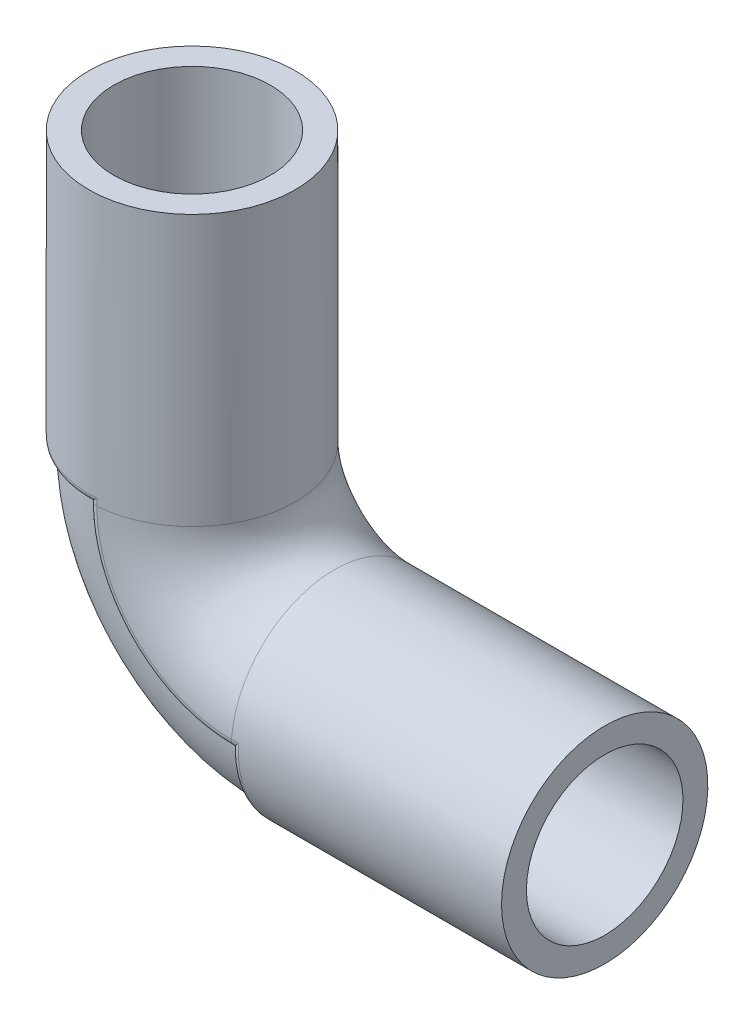
ISO-10303-21;
HEADER;
FILE_DESCRIPTION(('STEP AP214'),'2;1');
FILE_NAME('part.step','',(''),(''),'','','');
FILE_SCHEMA(('AUTOMOTIVE_DESIGN { 1 0 10303 214 1 1 1 1 }'));
ENDSEC;
DATA;
#1=APPLICATION_CONTEXT('core data for automotive mechanical design processes');
#2=APPLICATION_PROTOCOL_DEFINITION('international standard','automotive_design',2000,#1);
#3=PRODUCT_CONTEXT('',#1,'mechanical');
#4=PRODUCT('Part','Part','',(#3));
#5=PRODUCT_RELATED_PRODUCT_CATEGORY('part','',(#4));
#6=PRODUCT_DEFINITION_FORMATION('','',#4);
#7=PRODUCT_DEFINITION_CONTEXT('part definition',#1,'design');
#8=PRODUCT_DEFINITION('design','',#6,#7);
#9=PRODUCT_DEFINITION_SHAPE('','',#8);
#10=(LENGTH_UNIT() NAMED_UNIT(*) SI_UNIT(.MILLI.,.METRE.));
#11=(NAMED_UNIT(*) PLANE_ANGLE_UNIT() SI_UNIT($,.RADIAN.));
#12=(NAMED_UNIT(*) SI_UNIT($,.STERADIAN.) SOLID_ANGLE_UNIT());
#13=UNCERTAINTY_MEASURE_WITH_UNIT(LENGTH_MEASURE(1.E-05),#10,'distance_accuracy_value','');
#14=(GEOMETRIC_REPRESENTATION_CONTEXT(3) GLOBAL_UNCERTAINTY_ASSIGNED_CONTEXT((#13)) GLOBAL_UNIT_ASSIGNED_CONTEXT((#10,
#11,#12)) REPRESENTATION_CONTEXT('',''));
#15=CARTESIAN_POINT('',(0.,0.,0.));
#16=DIRECTION('',(0.,0.,1.));
#17=DIRECTION('',(1.,0.,0.));
#18=AXIS2_PLACEMENT_3D('',#15,#16,#17);
#19=CARTESIAN_POINT('',(20.,20.,0.));
#20=DIRECTION('',(0.,0.,1.));
#21=DIRECTION('',(1.,0.,0.));
#22=AXIS2_PLACEMENT_3D('',#19,#20,#21);
#23=TOROIDAL_SURFACE('',#22,20.0000000000004,14.5);
#24=CARTESIAN_POINT('',(20.0000000000001,0.,0.));
#25=DIRECTION('',(-1.,0.,0.));
#26=DIRECTION('',(0.,0.,1.));
#27=AXIS2_PLACEMENT_3D('',#24,#25,#26);
#28=CIRCLE('',#27,14.5);
#29=CARTESIAN_POINT('',(20.0000000000001,1.07333714494823,14.460219478738));
#30=VERTEX_POINT('',#29);
#31=CARTESIAN_POINT('',(20.0000000000001,1.07333714494705,-14.4602194787382));
#32=VERTEX_POINT('',#31);
#33=EDGE_CURVE('E326',#30,#32,#28,.T.);
#34=ORIENTED_EDGE('',*,*,#33,.T.);
#35=CARTESIAN_POINT('',(20.0000000000002,20.0000000000002,-14.460219478738));
#36=DIRECTION('',(0.,0.,1.));
#37=DIRECTION('',(1.,0.,0.));
#38=AXIS2_PLACEMENT_3D('',#35,#36,#37);
#39=CIRCLE('',#38,18.9266628550516);
#40=CARTESIAN_POINT('',(1.07333714494705,20.0000000000001,-14.4602194787382));
#41=VERTEX_POINT('',#40);
#42=EDGE_CURVE('E282',#32,#41,#39,.F.);
#43=ORIENTED_EDGE('',*,*,#42,.T.);
#44=CARTESIAN_POINT('',(0.,20.0000000000001,0.));
#45=DIRECTION('',(0.,1.,0.));
#46=DIRECTION('',(0.,0.,1.));
#47=AXIS2_PLACEMENT_3D('',#44,#45,#46);
#48=CIRCLE('',#47,14.5);
#49=CARTESIAN_POINT('',(1.07333714494823,20.0000000000001,14.460219478738));
#50=VERTEX_POINT('',#49);
#51=EDGE_CURVE('E325',#50,#41,#48,.T.);
#52=ORIENTED_EDGE('',*,*,#51,.F.);
#53=CARTESIAN_POINT('',(20.0000000000002,20.0000000000002,14.4602194787378));
#54=DIRECTION('',(0.,0.,-1.));
#55=DIRECTION('',(-1.,0.,0.));
#56=AXIS2_PLACEMENT_3D('',#53,#54,#55);
#57=CIRCLE('',#56,18.9266628550517);
#58=EDGE_CURVE('E142',#50,#30,#57,.F.);
#59=ORIENTED_EDGE('',*,*,#58,.T.);
#60=EDGE_LOOP('',(#34,#43,#52,#59));
#61=FACE_BOUND('',#60,.T.);
#62=ADVANCED_FACE('F44',(#61),#23,.T.);
#63=CARTESIAN_POINT('',(0.,58.,0.));
#64=DIRECTION('',(0.,-1.,0.));
#65=DIRECTION('',(0.,0.,-1.));
#66=AXIS2_PLACEMENT_3D('',#63,#64,#65);
#67=CYLINDRICAL_SURFACE('',#66,14.5);
#68=ORIENTED_EDGE('',*,*,#51,.T.);
#69=CARTESIAN_POINT('',(0.0646983123087329,18.3925963105887,-13.5));
#70=CARTESIAN_POINT('',(0.108368296469447,18.3895419345392,-14.5364157307015));
#71=CARTESIAN_POINT('',(1.13915791979438,18.4728964791616,-14.4551831269538));
#72=CARTESIAN_POINT('',(0.0363996600460458,18.7434508247518,-13.5));
#73=CARTESIAN_POINT('',(0.0777513723160988,18.7410433282352,-14.5367219092496));
#74=CARTESIAN_POINT('',(1.11037171634935,18.8062298566909,-14.4574144565209));
#75=CARTESIAN_POINT('',(0.0173806632408046,19.095059059414,-13.5));
#76=CARTESIAN_POINT('',(0.0571985536029757,19.0933180467772,-14.5368984945269));
#77=CARTESIAN_POINT('',(1.09102209634255,19.1402732361842,-14.4588900216303));
#78=CARTESIAN_POINT('',(-0.00205625623141033,19.7978189221536,-13.5));
#79=CARTESIAN_POINT('',(0.0362042412363847,19.7974527668298,-14.5370658681995));
#80=CARTESIAN_POINT('',(1.07124597262363,19.8079217479623,-14.4603872049827));
#81=CARTESIAN_POINT('',(-0.00252556464059526,20.1489691166365,-13.5));
#82=CARTESIAN_POINT('',(0.0357095393663063,20.1492679347153,-14.5370571498896));
#83=CARTESIAN_POINT('',(1.07076719353341,20.141525530599,-14.4604128398603));
#84=CARTESIAN_POINT('',(0.0150218266943723,20.8508032613276,-13.5));
#85=CARTESIAN_POINT('',(0.0546415892951053,20.8524110604805,-14.5369282390743));
#86=CARTESIAN_POINT('',(1.08862308738606,20.8082933221044,-14.4590794380943));
#87=CARTESIAN_POINT('',(0.0330384989538137,21.2014872122283,-13.5));
#88=CARTESIAN_POINT('',(0.0740670016949818,21.2037184850319,-14.5368080547353));
#89=CARTESIAN_POINT('',(1.1069577323574,21.1414573316262,-14.4577204035096));
#90=CARTESIAN_POINT('',(0.0875681420051222,21.9023792099268,-13.5));
#91=CARTESIAN_POINT('',(0.133142503997558,21.9059677713672,-14.5361306598162));
#92=CARTESIAN_POINT('',(1.16241781152524,21.8073488172217,-14.4533489849605));
#93=CARTESIAN_POINT('',(0.124132358869971,22.2525832280196,-13.5));
#94=CARTESIAN_POINT('',(0.172833518303441,22.2567844851374,-14.5355724589377));
#95=CARTESIAN_POINT('',(1.1995953074741,22.1400725091864,-14.4503320182652));
#96=CARTESIAN_POINT('',(0.169925224163276,22.6015638344513,-13.5));
#97=CARTESIAN_POINT('',(0.222733223063629,22.6063236063833,-14.5346319899954));
#98=CARTESIAN_POINT('',(1.24613160291782,22.4716479900093,-14.4463544199985));
#99=(BOUNDED_SURFACE() B_SPLINE_SURFACE(3,2,((#69,#70,#71),(#72,#73,#74),(#75,#76,#77),(#78,#79,
#80),(#81,#82,#83),(#84,#85,#86),(#87,#88,#89),(#90,#91,#92),(#93,#94,#95),(#96,#97,#98)),
.UNSPECIFIED.,.F.,.F.,.F.) B_SPLINE_SURFACE_WITH_KNOTS((4,2,2,2,4),(3,3),(0.,1.0031290493086,
2.00347906789508,3.00382759917657,4.00695522893697),(0.,1.),
.UNSPECIFIED.) GEOMETRIC_REPRESENTATION_ITEM() RATIONAL_B_SPLINE_SURFACE(((1.,0.694030552063765,
1.),(1.,0.693957886158268,1.),(1.,0.693918020027879,1.),(1.,0.693881305242108,1.),(1.,
0.693884337718714,1.),(1.,0.693910686045976,1.),(1.,0.693934001866477,1.),(1.,0.694100786883197,
1.),(1.,0.694244589701188,1.),(1.,0.694498922864589,1.))) REPRESENTATION_ITEM('') SURFACE());
#100=CARTESIAN_POINT('',(1.13915791979438,18.4728964791616,-14.4551831269538));
#101=CARTESIAN_POINT('',(1.11037171634935,18.8062298566909,-14.4574144565209));
#102=CARTESIAN_POINT('',(1.09102209634255,19.1402732361842,-14.4588900216303));
#103=CARTESIAN_POINT('',(1.07124597262363,19.8079217479623,-14.4603872049827));
#104=CARTESIAN_POINT('',(1.07076719353341,20.141525530599,-14.4604128398603));
#105=CARTESIAN_POINT('',(1.08862308738606,20.8082933221044,-14.4590794380943));
#106=CARTESIAN_POINT('',(1.1069577323574,21.1414573316262,-14.4577204035096));
#107=CARTESIAN_POINT('',(1.16241781152524,21.8073488172217,-14.4533489849605));
#108=CARTESIAN_POINT('',(1.1995953074741,22.1400725091864,-14.4503320182652));
#109=CARTESIAN_POINT('',(1.24613160291782,22.4716479900093,-14.4463544199985));
#110=B_SPLINE_CURVE_WITH_KNOTS('',3,(#100,#101,#102,#103,#104,#105,#106,#107,#108,#109),
.UNSPECIFIED.,.F.,.F.,(4,2,2,2,4),(0.,1.0031290493086,2.00347906789508,3.00382759917657,
4.00695522893697),.UNSPECIFIED.);
#111=CARTESIAN_POINT('',(1.1015400078443,21.,-14.4580984092348));
#112=VERTEX_POINT('',#111);
#113=EDGE_CURVE('E258',#41,#112,#110,.T.);
#114=ORIENTED_EDGE('',*,*,#113,.T.);
#115=CARTESIAN_POINT('',(0.,21.,0.));
#116=DIRECTION('',(0.,1.,0.));
#117=DIRECTION('',(0.,0.,1.));
#118=AXIS2_PLACEMENT_3D('',#115,#116,#117);
#119=CIRCLE('',#118,14.5);
#120=CARTESIAN_POINT('',(1.1015400078443,21.,14.4580984092348));
#121=VERTEX_POINT('',#120);
#122=EDGE_CURVE('E334',#112,#121,#119,.T.);
#123=ORIENTED_EDGE('',*,*,#122,.T.);
#124=CARTESIAN_POINT('',(1.13915791979437,18.4728964791616,14.4551831269538));
#125=CARTESIAN_POINT('',(0.108368296477715,18.3895419344437,14.5364157307009));
#126=CARTESIAN_POINT('',(0.0646983123161436,18.3925963104967,13.5));
#127=CARTESIAN_POINT('',(1.11037171634938,18.8062298566905,14.4574144565209));
#128=CARTESIAN_POINT('',(0.0777513725661896,18.7410433374481,14.5367219092309));
#129=CARTESIAN_POINT('',(0.0363996602710763,18.7434508336104,13.5));
#130=CARTESIAN_POINT('',(1.0910220963426,19.1402732361834,14.4588900216303));
#131=CARTESIAN_POINT('',(0.0571985537582045,19.0933180525399,14.5368984945153));
#132=CARTESIAN_POINT('',(0.0173806633803775,19.0950590649565,13.5));
#133=CARTESIAN_POINT('',(1.07124597262363,19.8079217479616,14.4603872049827));
#134=CARTESIAN_POINT('',(0.036204241081489,19.7974527610854,14.5370658682111));
#135=CARTESIAN_POINT('',(-0.00205625637056937,19.7978189166253,13.5));
#136=CARTESIAN_POINT('',(1.07076719353339,20.1415255305987,14.4604128398603));
#137=CARTESIAN_POINT('',(0.0357095389966667,20.1492679209302,14.5370571499172));
#138=CARTESIAN_POINT('',(-0.00252556497268866,20.1489691033655,13.5));
#139=CARTESIAN_POINT('',(1.08862308738606,20.8082933221044,14.4590794380943));
#140=CARTESIAN_POINT('',(0.0546415889262442,20.8524110467005,14.5369282391019));
#141=CARTESIAN_POINT('',(0.0150218263627442,20.8508032480524,13.5));
#142=CARTESIAN_POINT('',(1.1069577323574,21.1414573316262,14.4577204035096));
#143=CARTESIAN_POINT('',(0.0740670015413216,21.2037184792866,14.5368080547467));
#144=CARTESIAN_POINT('',(0.0330384988155648,21.2014872066915,13.5));
#145=CARTESIAN_POINT('',(1.16241781152524,21.8073488172217,14.4533489849605));
#146=CARTESIAN_POINT('',(0.133142504151485,21.9059677771257,14.5361306598047));
#147=CARTESIAN_POINT('',(0.0875681421439275,21.9023792154813,13.5));
#148=CARTESIAN_POINT('',(1.1995953074741,22.1400725091864,14.4503320182652));
#149=CARTESIAN_POINT('',(0.172833518549424,22.2567844943544,14.5355724589193));
#150=CARTESIAN_POINT('',(0.124132359092144,22.2525832369149,13.5));
#151=CARTESIAN_POINT('',(1.24613160291782,22.4716479900093,14.4463544199985));
#152=CARTESIAN_POINT('',(0.222733223063537,22.6063236063827,14.5346319899954));
#153=CARTESIAN_POINT('',(0.169925224163196,22.6015638344507,13.5));
#154=(BOUNDED_SURFACE() B_SPLINE_SURFACE(3,2,((#124,#125,#126),(#127,#128,#129),(#130,#131,
#132),(#133,#134,#135),(#136,#137,#138),(#139,#140,#141),(#142,#143,#144),(#145,#146,#147),
(#148,#149,#150),(#151,#152,#153)),.UNSPECIFIED.,.F.,.F.,.F.) B_SPLINE_SURFACE_WITH_KNOTS((4,2,
2,2,4),(3,3),(0.,1.0031290493075,2.00347906789508,3.00382759917659,4.00695522893697),(0.,1.),
.UNSPECIFIED.) GEOMETRIC_REPRESENTATION_ITEM() RATIONAL_B_SPLINE_SURFACE(((1.,0.694030552063974,
1.),(1.,0.693957886164308,1.),(1.,0.693918020031622,1.),(1.,0.693881305238373,1.),(1.,
0.693884337709804,1.),(1.,0.69391068603708,1.),(1.,0.693934001862769,1.),(1.,0.694100786886922,
1.),(1.,0.694244589707149,1.),(1.,0.694498922864587,1.))) REPRESENTATION_ITEM('') SURFACE());
#155=CARTESIAN_POINT('',(1.24613160291782,22.4716479900093,14.4463544199985));
#156=CARTESIAN_POINT('',(1.1995953074741,22.1400725091864,14.4503320182652));
#157=CARTESIAN_POINT('',(1.16241781152524,21.8073488172217,14.4533489849605));
#158=CARTESIAN_POINT('',(1.1069577323574,21.1414573316262,14.4577204035096));
#159=CARTESIAN_POINT('',(1.08862308738606,20.8082933221044,14.4590794380943));
#160=CARTESIAN_POINT('',(1.07076719353339,20.1415255305987,14.4604128398603));
#161=CARTESIAN_POINT('',(1.07124597262363,19.8079217479616,14.4603872049827));
#162=CARTESIAN_POINT('',(1.0910220963426,19.1402732361834,14.4588900216303));
#163=CARTESIAN_POINT('',(1.11037171634938,18.8062298566905,14.4574144565209));
#164=CARTESIAN_POINT('',(1.13915791979437,18.4728964791616,14.4551831269538));
#165=B_SPLINE_CURVE_WITH_KNOTS('',3,(#155,#156,#157,#158,#159,#160,#161,#162,#163,#164),
.UNSPECIFIED.,.F.,.F.,(4,2,2,2,4),(0.,1.00312762976038,2.00347616104189,3.00382617962947,
4.00695522893697),.UNSPECIFIED.);
#166=EDGE_CURVE('E138',#121,#50,#165,.T.);
#167=ORIENTED_EDGE('',*,*,#166,.T.);
#168=EDGE_LOOP('',(#68,#114,#123,#167));
#169=FACE_BOUND('',#168,.T.);
#170=CARTESIAN_POINT('',(0.,58.,0.));
#171=DIRECTION('',(0.,1.,0.));
#172=DIRECTION('',(0.,0.,1.));
#173=AXIS2_PLACEMENT_3D('',#170,#171,#172);
#174=CIRCLE('',#173,14.5);
#175=CARTESIAN_POINT('',(0.,58.,14.5));
#176=VERTEX_POINT('',#175);
#177=EDGE_CURVE('E344',#176,#176,#174,.T.);
#178=ORIENTED_EDGE('',*,*,#177,.F.);
#179=EDGE_LOOP('',(#178));
#180=FACE_BOUND('',#179,.T.);
#181=ADVANCED_FACE('F179',(#169,#180),#67,.T.);
#182=CARTESIAN_POINT('',(20.0000000000001,0.,0.));
#183=DIRECTION('',(1.,0.,0.));
#184=DIRECTION('',(0.,0.,-1.));
#185=AXIS2_PLACEMENT_3D('',#182,#183,#184);
#186=CYLINDRICAL_SURFACE('',#185,14.5);
#187=CARTESIAN_POINT('',(58.,0.,0.));
#188=DIRECTION('',(-1.,0.,0.));
#189=DIRECTION('',(0.,0.,1.));
#190=AXIS2_PLACEMENT_3D('',#187,#188,#189);
#191=CIRCLE('',#190,14.5);
#192=CARTESIAN_POINT('',(58.,0.,14.5));
#193=VERTEX_POINT('',#192);
#194=EDGE_CURVE('E347',#193,#193,#191,.T.);
#195=ORIENTED_EDGE('',*,*,#194,.T.);
#196=EDGE_LOOP('',(#195));
#197=FACE_BOUND('',#196,.T.);
#198=CARTESIAN_POINT('',(21.0000000000003,0.,0.));
#199=DIRECTION('',(-1.,0.,0.));
#200=DIRECTION('',(0.,-1.,0.));
#201=AXIS2_PLACEMENT_3D('',#198,#199,#200);
#202=CIRCLE('',#201,14.5);
#203=CARTESIAN_POINT('',(21.0000000000003,1.10154000784432,14.4580984092348));
#204=VERTEX_POINT('',#203);
#205=CARTESIAN_POINT('',(21.0000000000003,1.10154000784433,-14.4580984092348));
#206=VERTEX_POINT('',#205);
#207=EDGE_CURVE('E65',#204,#206,#202,.F.);
#208=ORIENTED_EDGE('',*,*,#207,.T.);
#209=CARTESIAN_POINT('',(18.4728964791618,1.13915791979435,-14.4551831269538));
#210=CARTESIAN_POINT('',(18.3895419344437,0.108368296477715,-14.5364157307009));
#211=CARTESIAN_POINT('',(18.3925963104967,0.0646983123161471,-13.5));
#212=CARTESIAN_POINT('',(18.8062298566907,1.11037171634936,-14.4574144565209));
#213=CARTESIAN_POINT('',(18.741043337448,0.0777513725661858,-14.5367219092309));
#214=CARTESIAN_POINT('',(18.7434508336103,0.0363996602710763,-13.5));
#215=CARTESIAN_POINT('',(19.1402732361837,1.09102209634259,-14.4588900216303));
#216=CARTESIAN_POINT('',(19.0933180525398,0.0571985537582011,-14.5368984945153));
#217=CARTESIAN_POINT('',(19.0950590649565,0.017380663380376,-13.5));
#218=CARTESIAN_POINT('',(19.8079217479618,1.07124597262364,-14.4603872049827));
#219=CARTESIAN_POINT('',(19.7974527610856,0.036204241081493,-14.5370658682111));
#220=CARTESIAN_POINT('',(19.7978189166255,-0.00205625637056788,-13.5));
#221=CARTESIAN_POINT('',(20.1415255305989,1.0707671935334,-14.4604128398603));
#222=CARTESIAN_POINT('',(20.1492679209306,0.0357095389966777,-14.5370571499172));
#223=CARTESIAN_POINT('',(20.1489691033659,-0.00252556497268283,-13.5));
#224=CARTESIAN_POINT('',(20.8082933221046,1.08862308738607,-14.4590794380943));
#225=CARTESIAN_POINT('',(20.8524110467011,0.0546415889262724,-14.5369282391019));
#226=CARTESIAN_POINT('',(20.850803248053,0.0150218263627661,-13.5));
#227=CARTESIAN_POINT('',(21.1414573316264,1.10695773235741,-14.4577204035096));
#228=CARTESIAN_POINT('',(21.2037184792872,0.0740670015413602,-14.5368080547467));
#229=CARTESIAN_POINT('',(21.2014872066921,0.0330384988155986,-13.5));
#230=CARTESIAN_POINT('',(21.8073488172219,1.16241781152526,-14.4533489849605));
#231=CARTESIAN_POINT('',(21.9059677771267,0.133142504151592,-14.5361306598047));
#232=CARTESIAN_POINT('',(21.9023792154823,0.0875681421440254,-13.5));
#233=CARTESIAN_POINT('',(22.1400725091866,1.19959530747412,-14.4503320182652));
#234=CARTESIAN_POINT('',(22.2567844943557,0.172833518549588,-14.5355724589193));
#235=CARTESIAN_POINT('',(22.2525832369162,0.124132359092295,-13.5));
#236=CARTESIAN_POINT('',(22.4716479900095,1.24613160291785,-14.4463544199985));
#237=CARTESIAN_POINT('',(22.6063236063846,0.222733223063805,-14.5346319899953));
#238=CARTESIAN_POINT('',(22.6015638344525,0.169925224163436,-13.5));
#239=(BOUNDED_SURFACE() B_SPLINE_SURFACE(3,2,((#209,#210,#211),(#212,#213,#214),(#215,#216,
#217),(#218,#219,#220),(#221,#222,#223),(#224,#225,#226),(#227,#228,#229),(#230,#231,#232),
(#233,#234,#235),(#236,#237,#238)),.UNSPECIFIED.,.F.,.F.,.F.) B_SPLINE_SURFACE_WITH_KNOTS((4,2,
2,2,4),(3,3),(0.,1.0031290493075,2.00347906789508,3.0038275991766,4.00695522893698),(0.,1.),
.UNSPECIFIED.) GEOMETRIC_REPRESENTATION_ITEM() RATIONAL_B_SPLINE_SURFACE(((1.,0.694030552063975,
1.),(1.,0.693957886164308,1.),(1.,0.693918020031622,1.),(1.,0.693881305238373,1.),(1.,
0.693884337709804,1.),(1.,0.693910686037081,1.),(1.,0.693934001862769,1.),(1.,0.694100786886923,
1.),(1.,0.694244589707152,1.),(1.,0.694498922864593,1.))) REPRESENTATION_ITEM('') SURFACE());
#240=CARTESIAN_POINT('',(22.4716479900095,1.24613160291785,-14.4463544199985));
#241=CARTESIAN_POINT('',(22.1400725091866,1.19959530747412,-14.4503320182652));
#242=CARTESIAN_POINT('',(21.8073488172219,1.16241781152526,-14.4533489849605));
#243=CARTESIAN_POINT('',(21.1414573316264,1.10695773235741,-14.4577204035096));
#244=CARTESIAN_POINT('',(20.8082933221046,1.08862308738607,-14.4590794380943));
#245=CARTESIAN_POINT('',(20.1415255305989,1.0707671935334,-14.4604128398603));
#246=CARTESIAN_POINT('',(19.8079217479618,1.07124597262363,-14.4603872049827));
#247=CARTESIAN_POINT('',(19.1402732361837,1.09102209634259,-14.4588900216303));
#248=CARTESIAN_POINT('',(18.8062298566907,1.11037171634936,-14.4574144565209));
#249=CARTESIAN_POINT('',(18.4728964791618,1.13915791979435,-14.4551831269538));
#250=B_SPLINE_CURVE_WITH_KNOTS('',3,(#240,#241,#242,#243,#244,#245,#246,#247,#248,#249),
.UNSPECIFIED.,.F.,.F.,(4,2,2,2,4),(0.,1.00312762976038,2.00347616104189,3.00382617962947,
4.00695522893698),.UNSPECIFIED.);
#251=EDGE_CURVE('E316',#206,#32,#250,.T.);
#252=ORIENTED_EDGE('',*,*,#251,.T.);
#253=ORIENTED_EDGE('',*,*,#33,.F.);
#254=CARTESIAN_POINT('',(18.3925963105187,0.0646983123143742,13.5));
#255=CARTESIAN_POINT('',(18.3895419344665,0.108368296475741,14.536415730701));
#256=CARTESIAN_POINT('',(18.4728964791618,1.13915791979435,14.4551831269538));
#257=CARTESIAN_POINT('',(18.7434508336172,0.036399660270407,13.5));
#258=CARTESIAN_POINT('',(18.7410433374552,0.0777513725654401,14.5367219092309));
#259=CARTESIAN_POINT('',(18.8062298566908,1.11037171634935,14.4574144565209));
#260=CARTESIAN_POINT('',(19.095059064958,0.0173806633801839,13.5));
#261=CARTESIAN_POINT('',(19.0933180525414,0.0571985537579879,14.5368984945153));
#262=CARTESIAN_POINT('',(19.1402732361837,1.09102209634258,14.4588900216303));
#263=CARTESIAN_POINT('',(19.7978189166239,-0.00205625637038323,13.5));
#264=CARTESIAN_POINT('',(19.797452761084,0.0362042410817013,14.5370658682111));
#265=CARTESIAN_POINT('',(19.8079217479619,1.07124597262363,14.4603872049827));
#266=CARTESIAN_POINT('',(20.1489691033668,-0.00252556497259713,13.5));
#267=CARTESIAN_POINT('',(20.1492679209315,0.0357095389967757,14.5370571499172));
#268=CARTESIAN_POINT('',(20.1415255305989,1.0707671935334,14.4604128398603));
#269=CARTESIAN_POINT('',(20.8508032480551,0.0150218263627498,13.5));
#270=CARTESIAN_POINT('',(20.8524110467032,0.0546415889262561,14.5369282391019));
#271=CARTESIAN_POINT('',(20.8082933221047,1.08862308738608,14.4590794380943));
#272=CARTESIAN_POINT('',(21.2014872066929,0.033038498815579,13.5));
#273=CARTESIAN_POINT('',(21.2037184792881,0.0740670015413396,14.5368080547467));
#274=CARTESIAN_POINT('',(21.1414573316265,1.10695773235742,14.4577204035096));
#275=CARTESIAN_POINT('',(21.9023792154813,0.0875681421440314,13.5));
#276=CARTESIAN_POINT('',(21.9059677771257,0.133142504151599,14.5361306598047));
#277=CARTESIAN_POINT('',(21.807348817222,1.16241781152526,14.4533489849605));
#278=CARTESIAN_POINT('',(22.2525832369147,0.12413235909233,13.5));
#279=CARTESIAN_POINT('',(22.2567844943541,0.172833518549628,14.5355724589193));
#280=CARTESIAN_POINT('',(22.1400725091867,1.19959530747412,14.4503320182652));
#281=CARTESIAN_POINT('',(22.6015638344529,0.169925224163484,13.5));
#282=CARTESIAN_POINT('',(22.606323606385,0.22273322306386,14.5346319899953));
#283=CARTESIAN_POINT('',(22.4716479900096,1.24613160291785,14.4463544199985));
#284=(BOUNDED_SURFACE() B_SPLINE_SURFACE(3,2,((#254,#255,#256),(#257,#258,#259),(#260,#261,
#262),(#263,#264,#265),(#266,#267,#268),(#269,#270,#271),(#272,#273,#274),(#275,#276,#277),
(#278,#279,#280),(#281,#282,#283)),.UNSPECIFIED.,.F.,.F.,.F.) B_SPLINE_SURFACE_WITH_KNOTS((4,2,
2,2,4),(3,3),(0.,1.00312904930751,2.00347906789509,3.00382759917659,4.00695522893697),(0.,1.),
.UNSPECIFIED.) GEOMETRIC_REPRESENTATION_ITEM() RATIONAL_B_SPLINE_SURFACE(((1.,0.694030552063925,
1.),(1.,0.69395788616429,1.),(1.,0.693918020031617,1.),(1.,0.693881305238379,1.),(1.,
0.693884337709806,1.),(1.,0.69391068603708,1.),(1.,0.693934001862769,1.),(1.,0.694100786886925,
1.),(1.,0.694244589707155,1.),(1.,0.694498922864594,1.))) REPRESENTATION_ITEM('') SURFACE());
#285=CARTESIAN_POINT('',(18.4728964791618,1.13915791979435,14.4551831269538));
#286=CARTESIAN_POINT('',(18.8062298566908,1.11037171634935,14.4574144565209));
#287=CARTESIAN_POINT('',(19.1402732361837,1.09102209634258,14.4588900216303));
#288=CARTESIAN_POINT('',(19.8079217479619,1.07124597262363,14.4603872049827));
#289=CARTESIAN_POINT('',(20.1415255305989,1.0707671935334,14.4604128398603));
#290=CARTESIAN_POINT('',(20.8082933221047,1.08862308738608,14.4590794380943));
#291=CARTESIAN_POINT('',(21.1414573316265,1.10695773235742,14.4577204035096));
#292=CARTESIAN_POINT('',(21.807348817222,1.16241781152526,14.4533489849605));
#293=CARTESIAN_POINT('',(22.1400725091867,1.19959530747412,14.4503320182652));
#294=CARTESIAN_POINT('',(22.4716479900096,1.24613160291785,14.4463544199985));
#295=B_SPLINE_CURVE_WITH_KNOTS('',3,(#285,#286,#287,#288,#289,#290,#291,#292,#293,#294),
.UNSPECIFIED.,.F.,.F.,(4,2,2,2,4),(0.,1.00312904930751,2.00347906789509,3.00382759917659,
4.00695522893697),.UNSPECIFIED.);
#296=EDGE_CURVE('E310',#30,#204,#295,.T.);
#297=ORIENTED_EDGE('',*,*,#296,.T.);
#298=EDGE_LOOP('',(#208,#252,#253,#297));
#299=FACE_BOUND('',#298,.T.);
#300=ADVANCED_FACE('F232',(#197,#299),#186,.T.);
#301=CARTESIAN_POINT('',(0.,58.,0.));
#302=DIRECTION('',(0.,1.,0.));
#303=DIRECTION('',(0.,0.,1.));
#304=AXIS2_PLACEMENT_3D('',#301,#302,#303);
#305=PLANE('',#304);
#306=CARTESIAN_POINT('',(0.,58.,0.));
#307=DIRECTION('',(0.,1.,0.));
#308=DIRECTION('',(0.,0.,1.));
#309=AXIS2_PLACEMENT_3D('',#306,#307,#308);
#310=CIRCLE('',#309,11.);
#311=CARTESIAN_POINT('',(0.,58.,11.));
#312=VERTEX_POINT('',#311);
#313=EDGE_CURVE('E350',#312,#312,#310,.F.);
#314=ORIENTED_EDGE('',*,*,#313,.T.);
#315=EDGE_LOOP('',(#314));
#316=FACE_BOUND('',#315,.T.);
#317=ORIENTED_EDGE('',*,*,#177,.T.);
#318=EDGE_LOOP('',(#317));
#319=FACE_BOUND('',#318,.T.);
#320=ADVANCED_FACE('F250',(#316,#319),#305,.T.);
#321=CARTESIAN_POINT('',(58.,0.,0.));
#322=DIRECTION('',(-1.,0.,0.));
#323=DIRECTION('',(0.,0.,1.));
#324=AXIS2_PLACEMENT_3D('',#321,#322,#323);
#325=PLANE('',#324);
#326=CARTESIAN_POINT('',(58.,0.,0.));
#327=DIRECTION('',(-1.,0.,0.));
#328=DIRECTION('',(0.,0.,1.));
#329=AXIS2_PLACEMENT_3D('',#326,#327,#328);
#330=CIRCLE('',#329,11.);
#331=CARTESIAN_POINT('',(58.,0.,11.));
#332=VERTEX_POINT('',#331);
#333=EDGE_CURVE('E343',#332,#332,#330,.F.);
#334=ORIENTED_EDGE('',*,*,#333,.F.);
#335=EDGE_LOOP('',(#334));
#336=FACE_BOUND('',#335,.T.);
#337=ORIENTED_EDGE('',*,*,#194,.F.);
#338=EDGE_LOOP('',(#337));
#339=FACE_BOUND('',#338,.T.);
#340=ADVANCED_FACE('F247',(#336,#339),#325,.F.);
#341=CARTESIAN_POINT('',(0.,58.,0.));
#342=DIRECTION('',(0.,-1.,0.));
#343=DIRECTION('',(0.,0.,-1.));
#344=AXIS2_PLACEMENT_3D('',#341,#342,#343);
#345=CYLINDRICAL_SURFACE('',#344,11.);
#346=CARTESIAN_POINT('',(0.,20.0000000000001,0.));
#347=DIRECTION('',(0.,1.,0.));
#348=DIRECTION('',(0.,0.,1.));
#349=AXIS2_PLACEMENT_3D('',#346,#347,#348);
#350=CIRCLE('',#349,11.);
#351=CARTESIAN_POINT('',(-11.0000000000004,20.0000000000002,0.));
#352=VERTEX_POINT('',#351);
#353=EDGE_CURVE('E355',#352,#352,#350,.F.);
#354=ORIENTED_EDGE('',*,*,#353,.T.);
#355=EDGE_LOOP('',(#354));
#356=FACE_BOUND('',#355,.T.);
#357=ORIENTED_EDGE('',*,*,#313,.F.);
#358=EDGE_LOOP('',(#357));
#359=FACE_BOUND('',#358,.T.);
#360=ADVANCED_FACE('F242',(#356,#359),#345,.F.);
#361=CARTESIAN_POINT('',(20.,20.,0.));
#362=DIRECTION('',(0.,0.,1.));
#363=DIRECTION('',(1.,0.,0.));
#364=AXIS2_PLACEMENT_3D('',#361,#362,#363);
#365=TOROIDAL_SURFACE('',#364,20.0000000000004,11.);
#366=CARTESIAN_POINT('',(20.0000000000001,0.,0.));
#367=DIRECTION('',(-1.,0.,0.));
#368=DIRECTION('',(0.,0.,1.));
#369=AXIS2_PLACEMENT_3D('',#366,#367,#368);
#370=CIRCLE('',#369,11.);
#371=CARTESIAN_POINT('',(20.0000000000002,-11.0000000000004,0.));
#372=VERTEX_POINT('',#371);
#373=EDGE_CURVE('E352',#372,#372,#370,.F.);
#374=CARTESIAN_POINT('',(20.,20.,0.));
#375=DIRECTION('',(0.,0.,1.));
#376=DIRECTION('',(1.,0.,0.));
#377=AXIS2_PLACEMENT_3D('',#374,#375,#376);
#378=CIRCLE('',#377,31.0000000000004);
#379=EDGE_CURVE('',#352,#372,#378,.T.);
#380=ORIENTED_EDGE('',*,*,#353,.F.);
#381=ORIENTED_EDGE('',*,*,#373,.T.);
#382=ORIENTED_EDGE('',*,*,#379,.T.);
#383=ORIENTED_EDGE('',*,*,#379,.F.);
#384=EDGE_LOOP('',(#380,#382,#381,#383));
#385=FACE_BOUND('',#384,.T.);
#386=ADVANCED_FACE('F236',(#385),#365,.F.);
#387=CARTESIAN_POINT('',(20.0000000000001,0.,0.));
#388=DIRECTION('',(1.,0.,0.));
#389=DIRECTION('',(0.,0.,-1.));
#390=AXIS2_PLACEMENT_3D('',#387,#388,#389);
#391=CYLINDRICAL_SURFACE('',#390,11.);
#392=ORIENTED_EDGE('',*,*,#333,.T.);
#393=EDGE_LOOP('',(#392));
#394=FACE_BOUND('',#393,.T.);
#395=ORIENTED_EDGE('',*,*,#373,.F.);
#396=EDGE_LOOP('',(#395));
#397=FACE_BOUND('',#396,.T.);
#398=ADVANCED_FACE('F178',(#394,#397),#391,.F.);
#399=CARTESIAN_POINT('',(20.0000000000002,20.0000000000002,0.));
#400=DIRECTION('',(0.,0.,1.));
#401=DIRECTION('',(1.,0.,0.));
#402=AXIS2_PLACEMENT_3D('',#399,#400,#401);
#403=TOROIDAL_SURFACE('',#402,20.0000000000002,13.5);
#404=CARTESIAN_POINT('',(20.0000000000002,20.0000000000002,-13.5));
#405=DIRECTION('',(0.,0.,1.));
#406=DIRECTION('',(-1.,0.,0.));
#407=AXIS2_PLACEMENT_3D('',#404,#405,#406);
#408=CIRCLE('',#407,20.0000000000002);
#409=CARTESIAN_POINT('',(0.,20.,-13.5));
#410=VERTEX_POINT('',#409);
#411=CARTESIAN_POINT('',(20.0000000000003,0.,-13.5));
#412=VERTEX_POINT('',#411);
#413=EDGE_CURVE('E331',#410,#412,#408,.T.);
#414=ORIENTED_EDGE('',*,*,#413,.T.);
#415=CARTESIAN_POINT('',(20.0000000000003,0.,0.));
#416=DIRECTION('',(1.,0.,0.));
#417=DIRECTION('',(0.,0.,1.));
#418=AXIS2_PLACEMENT_3D('',#415,#416,#417);
#419=CIRCLE('',#418,13.5);
#420=CARTESIAN_POINT('',(20.0000000000003,0.,13.5));
#421=VERTEX_POINT('',#420);
#422=EDGE_CURVE('E118',#421,#412,#419,.T.);
#423=ORIENTED_EDGE('',*,*,#422,.F.);
#424=CARTESIAN_POINT('',(20.0000000000002,20.0000000000002,13.5));
#425=DIRECTION('',(0.,0.,1.));
#426=DIRECTION('',(-1.,0.,0.));
#427=AXIS2_PLACEMENT_3D('',#424,#425,#426);
#428=CIRCLE('',#427,20.0000000000002);
#429=CARTESIAN_POINT('',(0.,20.,13.5));
#430=VERTEX_POINT('',#429);
#431=EDGE_CURVE('E112',#430,#421,#428,.T.);
#432=ORIENTED_EDGE('',*,*,#431,.F.);
#433=CARTESIAN_POINT('',(0.,20.,0.));
#434=DIRECTION('',(0.,-1.,0.));
#435=DIRECTION('',(0.,0.,1.));
#436=AXIS2_PLACEMENT_3D('',#433,#434,#435);
#437=CIRCLE('',#436,13.5);
#438=EDGE_CURVE('E115',#430,#410,#437,.T.);
#439=ORIENTED_EDGE('',*,*,#438,.T.);
#440=EDGE_LOOP('',(#414,#423,#432,#439));
#441=FACE_BOUND('',#440,.T.);
#442=ADVANCED_FACE('F114',(#441),#403,.T.);
#443=CARTESIAN_POINT('',(0.,21.,0.));
#444=DIRECTION('',(0.,1.,0.));
#445=DIRECTION('',(0.,0.,1.));
#446=AXIS2_PLACEMENT_3D('',#443,#444,#445);
#447=TOROIDAL_SURFACE('',#446,13.5,1.);
#448=ORIENTED_EDGE('',*,*,#122,.F.);
#449=CARTESIAN_POINT('',(0.,20.,-13.5));
#450=CARTESIAN_POINT('',(0.000833823145621025,19.9999970044464,-13.5225560924664));
#451=CARTESIAN_POINT('',(0.00243675872478293,20.0007637803483,-13.5450690917557));
#452=CARTESIAN_POINT('',(0.00713960438541451,20.0037901910188,-13.5898186126152));
#453=CARTESIAN_POINT('',(0.0102382753534634,20.0060485906495,-13.6120553474382));
#454=CARTESIAN_POINT('',(0.0216489612605455,20.0149378212876,-13.6777126505323));
#455=CARTESIAN_POINT('',(0.0320928774698967,20.0236845878234,-13.7205057578961));
#456=CARTESIAN_POINT('',(0.0579548038625782,20.046081659113,-13.8029857807515));
#457=CARTESIAN_POINT('',(0.0733580955691432,20.0597174675633,-13.8426814610364));
#458=CARTESIAN_POINT('',(0.108343510180888,20.0910556919711,-13.9185376076842));
#459=CARTESIAN_POINT('',(0.127935142887257,20.1087673694729,-13.9546897511885));
#460=CARTESIAN_POINT('',(0.178973881312056,20.1551392563378,-14.0367192692986));
#461=CARTESIAN_POINT('',(0.212031617416159,20.1853476265232,-14.0807180341847));
#462=CARTESIAN_POINT('',(0.282862092384022,20.2501990256186,-14.1609340165417));
#463=CARTESIAN_POINT('',(0.320642862586886,20.2848496109687,-14.1971376862531));
#464=CARTESIAN_POINT('',(0.413876357721005,20.370369624284,-14.2738944646415));
#465=CARTESIAN_POINT('',(0.470758310432953,20.4225538795315,-14.3112393855348));
#466=CARTESIAN_POINT('',(0.58821416472849,20.5302112019001,-14.3731266359164));
#467=CARTESIAN_POINT('',(0.64879330274282,20.5856889304822,-14.3976503132487));
#468=CARTESIAN_POINT('',(0.773655023292914,20.6999734313611,-14.4353639879183));
#469=CARTESIAN_POINT('',(0.837993985713266,20.7588300439861,-14.4482090953044));
#470=CARTESIAN_POINT('',(0.967243362688665,20.8770569141223,-14.4620598672618));
#471=CARTESIAN_POINT('',(1.03215229213781,20.936425832227,-14.4630903565194));
#472=CARTESIAN_POINT('',(1.09832086037453,20.9970503818689,-14.458340124386));
#473=CARTESIAN_POINT('',(1.09993054846568,20.9985252633123,-14.4582210265466));
#474=CARTESIAN_POINT('',(1.10154000784635,21.0000000000001,-14.4580984092347));
#475=B_SPLINE_CURVE_WITH_KNOTS('',3,(#449,#450,#451,#452,#453,#454,#455,#456,#457,#458,#459,
#460,#461,#462,#463,#464,#465,#466,#467,#468,#469,#470,#471,#472,#473,#474),.UNSPECIFIED.,.F.,
.F.,(4,2,2,2,2,2,2,2,2,2,2,2,4),(0.,0.0676612541167278,0.135266551509422,0.269219849517742,
0.402779208648308,0.5366451031898,0.723948117186683,0.911574079347819,1.16744934012742,
1.42369581585719,1.68728476758968,1.95031976868851,1.9568790991793),.UNSPECIFIED.);
#476=EDGE_CURVE('E130',#112,#410,#475,.F.);
#477=ORIENTED_EDGE('',*,*,#476,.T.);
#478=ORIENTED_EDGE('',*,*,#438,.F.);
#479=CARTESIAN_POINT('',(0.,20.,13.5));
#480=CARTESIAN_POINT('',(0.000833823146633687,19.9999970044463,13.5225560924661));
#481=CARTESIAN_POINT('',(0.00243675872591567,20.0007637803483,13.5450690917552));
#482=CARTESIAN_POINT('',(0.00713960438612328,20.0037901910187,13.5898186126145));
#483=CARTESIAN_POINT('',(0.0102382753536318,20.0060485906494,13.6120553474375));
#484=CARTESIAN_POINT('',(0.0216489612597575,20.0149378212874,13.6777126505311));
#485=CARTESIAN_POINT('',(0.0320928774693417,20.023684587823,13.7205057578946));
#486=CARTESIAN_POINT('',(0.0579548038617446,20.0460816591121,13.8029857807486));
#487=CARTESIAN_POINT('',(0.0733580955677312,20.059717467562,13.8426814610328));
#488=CARTESIAN_POINT('',(0.10834351017874,20.0910556919693,13.9185376076801));
#489=CARTESIAN_POINT('',(0.127935142885071,20.108767369471,13.9546897511849));
#490=CARTESIAN_POINT('',(0.178973881309762,20.1551392563355,14.0367192692951));
#491=CARTESIAN_POINT('',(0.212031617413847,20.1853476265205,14.0807180341811));
#492=CARTESIAN_POINT('',(0.282862092381065,20.2501990256155,14.1609340165382));
#493=CARTESIAN_POINT('',(0.320642862583312,20.2848496109656,14.19713768625));
#494=CARTESIAN_POINT('',(0.413876357716819,20.37036962428,14.2738944646383));
#495=CARTESIAN_POINT('',(0.47075831042914,20.4225538795263,14.3112393855313));
#496=CARTESIAN_POINT('',(0.588214164724206,20.5302112018941,14.3731266359134));
#497=CARTESIAN_POINT('',(0.648793302737713,20.5856889304766,14.3976503132464));
#498=CARTESIAN_POINT('',(0.773655023287386,20.6999734313571,14.4353639879174));
#499=CARTESIAN_POINT('',(0.837993985708179,20.7588300439833,14.4482090953039));
#500=CARTESIAN_POINT('',(0.967243362686505,20.8770569141203,14.4620598672618));
#501=CARTESIAN_POINT('',(1.03215229213814,20.9364258322244,14.4630903565194));
#502=CARTESIAN_POINT('',(1.0983208603746,20.9970503818688,14.458340124386));
#503=CARTESIAN_POINT('',(1.09993054846571,20.9985252633123,14.4582210265466));
#504=CARTESIAN_POINT('',(1.10154000784634,21.0000000000001,14.4580984092347));
#505=B_SPLINE_CURVE_WITH_KNOTS('',3,(#479,#480,#481,#482,#483,#484,#485,#486,#487,#488,#489,
#490,#491,#492,#493,#494,#495,#496,#497,#498,#499,#500,#501,#502,#503,#504),.UNSPECIFIED.,.F.,
.F.,(4,2,2,2,2,2,2,2,2,2,2,2,4),(0.,0.067661254116214,0.135266551508536,0.269219849515604,
0.402779208643087,0.536645103185361,0.723948117181254,0.911574079341821,1.16744934011948,
1.42369581584899,1.68728476758504,1.95031976868831,1.95687909917911),.UNSPECIFIED.);
#506=EDGE_CURVE('E57',#430,#121,#505,.T.);
#507=ORIENTED_EDGE('',*,*,#506,.T.);
#508=EDGE_LOOP('',(#448,#477,#478,#507));
#509=FACE_BOUND('',#508,.T.);
#510=ADVANCED_FACE('F127',(#509),#447,.T.);
#511=CARTESIAN_POINT('',(21.0000000000003,0.,0.));
#512=DIRECTION('',(-1.,0.,0.));
#513=DIRECTION('',(0.,-1.,0.));
#514=AXIS2_PLACEMENT_3D('',#511,#512,#513);
#515=TOROIDAL_SURFACE('',#514,13.5,1.);
#516=ORIENTED_EDGE('',*,*,#422,.T.);
#517=CARTESIAN_POINT('',(20.0000000000003,0.,-13.5));
#518=CARTESIAN_POINT('',(19.9999970044466,0.000833823146007312,-13.5225560924663));
#519=CARTESIAN_POINT('',(20.0007637803486,0.00243675872521967,-13.5450690917555));
#520=CARTESIAN_POINT('',(20.0037901910191,0.00713960438570232,-13.589818612615));
#521=CARTESIAN_POINT('',(20.0060485906498,0.0102382753535536,-13.6120553474381));
#522=CARTESIAN_POINT('',(20.0149378212879,0.021648961260312,-13.6777126505322));
#523=CARTESIAN_POINT('',(20.0236845878237,0.0320928774697942,-13.7205057578961));
#524=CARTESIAN_POINT('',(20.0460816591132,0.0579548038625792,-13.8029857807512));
#525=CARTESIAN_POINT('',(20.0597174675633,0.0733580955690781,-13.8426814610358));
#526=CARTESIAN_POINT('',(20.0910556919712,0.108343510180482,-13.9185376076837));
#527=CARTESIAN_POINT('',(20.1087673694732,0.127935142886631,-13.9546897511885));
#528=CARTESIAN_POINT('',(20.1551392563375,0.178973881312436,-14.0367192692978));
#529=CARTESIAN_POINT('',(20.1853476265217,0.212031617418467,-14.0807180341824));
#530=CARTESIAN_POINT('',(20.250199025617,0.282862092386294,-14.1609340165395));
#531=CARTESIAN_POINT('',(20.2848496109685,0.32064286258727,-14.1971376862524));
#532=CARTESIAN_POINT('',(20.3703696242845,0.413876357719856,-14.2738944646419));
#533=CARTESIAN_POINT('',(20.4225538795307,0.470758310433376,-14.3112393855342));
#534=CARTESIAN_POINT('',(20.530211201899,0.58821416472956,-14.3731266359155));
#535=CARTESIAN_POINT('',(20.5856889304821,0.648793302742984,-14.3976503132484));
#536=CARTESIAN_POINT('',(20.6999734313618,0.773655023292678,-14.4353639879185));
#537=CARTESIAN_POINT('',(20.7588300439865,0.837993985713577,-14.4482090953044));
#538=CARTESIAN_POINT('',(20.8770569141218,0.967243362689866,-14.4620598672616));
#539=CARTESIAN_POINT('',(20.9364258322257,1.03215229213936,-14.4630903565192));
#540=CARTESIAN_POINT('',(20.997050381869,1.09832086037458,-14.458340124386));
#541=CARTESIAN_POINT('',(20.9985252633125,1.09993054846571,-14.4582210265466));
#542=CARTESIAN_POINT('',(21.0000000000003,1.10154000784636,-14.4580984092347));
#543=B_SPLINE_CURVE_WITH_KNOTS('',3,(#517,#518,#519,#520,#521,#522,#523,#524,#525,#526,#527,
#528,#529,#530,#531,#532,#533,#534,#535,#536,#537,#538,#539,#540,#541,#542),.UNSPECIFIED.,.F.,
.F.,(4,2,2,2,2,2,2,2,2,2,2,2,4),(0.,0.0676612541166095,0.135266551509259,0.269219849517717,
0.402779208647381,0.536645103189775,0.723948117184807,0.911574079347464,1.16744934012619,
1.42369581585674,1.68728476758966,1.95031976868793,1.95687909917878),.UNSPECIFIED.);
#544=EDGE_CURVE('E139',#412,#206,#543,.T.);
#545=ORIENTED_EDGE('',*,*,#544,.T.);
#546=ORIENTED_EDGE('',*,*,#207,.F.);
#547=CARTESIAN_POINT('',(20.0000000000003,0.,13.5));
#548=CARTESIAN_POINT('',(19.9999970044466,0.000833823145846392,13.5225560924663));
#549=CARTESIAN_POINT('',(20.0007637803486,0.00243675872504097,13.5450690917556));
#550=CARTESIAN_POINT('',(20.0037901910191,0.00713960438559224,13.5898186126151));
#551=CARTESIAN_POINT('',(20.0060485906498,0.0102382753535293,13.6120553474382));
#552=CARTESIAN_POINT('',(20.0149378212879,0.0216489612604234,13.6777126505323));
#553=CARTESIAN_POINT('',(20.0236845878237,0.0320928774698418,13.7205057578961));
#554=CARTESIAN_POINT('',(20.0460816591131,0.0579548038625103,13.8029857807511));
#555=CARTESIAN_POINT('',(20.0597174675633,0.0733580955689485,13.8426814610356));
#556=CARTESIAN_POINT('',(20.0910556919711,0.108343510180421,13.9185376076835));
#557=CARTESIAN_POINT('',(20.1087673694731,0.127935142886721,13.9546897511884));
#558=CARTESIAN_POINT('',(20.1551392563377,0.178973881312319,14.0367192692981));
#559=CARTESIAN_POINT('',(20.1853476265223,0.212031617417759,14.0807180341831));
#560=CARTESIAN_POINT('',(20.2501990256177,0.282862092385462,14.1609340165403));
#561=CARTESIAN_POINT('',(20.2848496109689,0.320642862586879,14.1971376862528));
#562=CARTESIAN_POINT('',(20.3703696242839,0.413876357720344,14.2738944646414));
#563=CARTESIAN_POINT('',(20.4225538795294,0.470758310434252,14.3112393855333));
#564=CARTESIAN_POINT('',(20.530211201898,0.588214164730063,14.3731266359149));
#565=CARTESIAN_POINT('',(20.585688930482,0.648793302742747,14.3976503132483));
#566=CARTESIAN_POINT('',(20.6999734313619,0.773655023293022,14.4353639879187));
#567=CARTESIAN_POINT('',(20.7588300439859,0.837993985715302,14.4482090953042));
#568=CARTESIAN_POINT('',(20.8770569141209,0.967243362691923,14.4620598672613));
#569=CARTESIAN_POINT('',(20.9364258322254,1.03215229214036,14.4630903565192));
#570=CARTESIAN_POINT('',(20.9970503818691,1.09832086037465,14.458340124386));
#571=CARTESIAN_POINT('',(20.9985252633125,1.09993054846574,14.4582210265466));
#572=CARTESIAN_POINT('',(21.0000000000004,1.10154000784636,14.4580984092347));
#573=B_SPLINE_CURVE_WITH_KNOTS('',3,(#547,#548,#549,#550,#551,#552,#553,#554,#555,#556,#557,
#558,#559,#560,#561,#562,#563,#564,#565,#566,#567,#568,#569,#570,#571,#572),.UNSPECIFIED.,.F.,
.F.,(4,2,2,2,2,2,2,2,2,2,2,2,4),(0.,0.0676612541167053,0.135266551509425,0.269219849517727,
0.402779208647031,0.536645103189783,0.723948117185433,0.911574079347583,1.16744934012545,
1.42369581585676,1.68728476759093,1.95031976868803,1.95687909917882),.UNSPECIFIED.);
#574=EDGE_CURVE('E13',#204,#421,#573,.F.);
#575=ORIENTED_EDGE('',*,*,#574,.T.);
#576=EDGE_LOOP('',(#516,#545,#546,#575));
#577=FACE_BOUND('',#576,.T.);
#578=ADVANCED_FACE('F223',(#577),#515,.T.);
#579=ORIENTED_EDGE('',*,*,#251,.F.);
#580=ORIENTED_EDGE('',*,*,#544,.F.);
#581=CARTESIAN_POINT('',(20.0000000000001,0.999313893573592,-13.4629629629629));
#582=DIRECTION('',(-1.,0.,0.));
#583=DIRECTION('',(0.,-1.,0.));
#584=AXIS2_PLACEMENT_3D('',#581,#582,#583);
#585=CIRCLE('',#584,1.);
#586=EDGE_CURVE('E131',#32,#412,#585,.T.);
#587=ORIENTED_EDGE('',*,*,#586,.F.);
#588=EDGE_LOOP('',(#579,#580,#587));
#589=FACE_BOUND('',#588,.T.);
#590=ADVANCED_FACE('F194',(#589),#239,.T.);
#591=CARTESIAN_POINT('',(20.0000000000002,20.0000000000002,-13.4629629629629));
#592=DIRECTION('',(0.,0.,-1.));
#593=DIRECTION('',(-1.,0.,0.));
#594=AXIS2_PLACEMENT_3D('',#591,#592,#593);
#595=TOROIDAL_SURFACE('',#594,19.0006861064274,1.);
#596=CARTESIAN_POINT('',(0.999313893572741,20.0000000000001,-13.4629629629629));
#597=DIRECTION('',(-1.35029859434321E-13,1.,0.));
#598=DIRECTION('',(-1.,-1.35029859434321E-13,0.));
#599=AXIS2_PLACEMENT_3D('',#596,#597,#598);
#600=CIRCLE('',#599,1.);
#601=EDGE_CURVE('E145',#41,#410,#600,.T.);
#602=ORIENTED_EDGE('',*,*,#601,.F.);
#603=ORIENTED_EDGE('',*,*,#42,.F.);
#604=ORIENTED_EDGE('',*,*,#586,.T.);
#605=ORIENTED_EDGE('',*,*,#413,.F.);
#606=EDGE_LOOP('',(#602,#603,#604,#605));
#607=FACE_BOUND('',#606,.T.);
#608=ADVANCED_FACE('F213',(#607),#595,.T.);
#609=ORIENTED_EDGE('',*,*,#113,.F.);
#610=ORIENTED_EDGE('',*,*,#601,.T.);
#611=ORIENTED_EDGE('',*,*,#476,.F.);
#612=EDGE_LOOP('',(#609,#610,#611));
#613=FACE_BOUND('',#612,.T.);
#614=ADVANCED_FACE('F215',(#613),#99,.T.);
#615=ORIENTED_EDGE('',*,*,#574,.F.);
#616=ORIENTED_EDGE('',*,*,#296,.F.);
#617=CARTESIAN_POINT('',(20.0000000000003,0.999313893572741,13.462962962963));
#618=DIRECTION('',(-1.,0.,0.));
#619=DIRECTION('',(0.,-1.,0.));
#620=AXIS2_PLACEMENT_3D('',#617,#618,#619);
#621=CIRCLE('',#620,1.);
#622=EDGE_CURVE('E143',#421,#30,#621,.T.);
#623=ORIENTED_EDGE('',*,*,#622,.F.);
#624=EDGE_LOOP('',(#615,#616,#623));
#625=FACE_BOUND('',#624,.T.);
#626=ADVANCED_FACE('F221',(#625),#284,.T.);
#627=CARTESIAN_POINT('',(20.0000000000002,20.0000000000002,13.4629629629629));
#628=DIRECTION('',(0.,0.,-1.));
#629=DIRECTION('',(-1.,0.,0.));
#630=AXIS2_PLACEMENT_3D('',#627,#628,#629);
#631=TOROIDAL_SURFACE('',#630,19.0006861064275,1.);
#632=ORIENTED_EDGE('',*,*,#622,.T.);
#633=ORIENTED_EDGE('',*,*,#58,.F.);
#634=CARTESIAN_POINT('',(0.99931389357274,20.,13.4629629629629));
#635=DIRECTION('',(0.,1.,-1.24129102058785E-13));
#636=DIRECTION('',(0.,1.24129102058785E-13,1.));
#637=AXIS2_PLACEMENT_3D('',#634,#635,#636);
#638=CIRCLE('',#637,1.);
#639=EDGE_CURVE('E135',#430,#50,#638,.T.);
#640=ORIENTED_EDGE('',*,*,#639,.F.);
#641=ORIENTED_EDGE('',*,*,#431,.T.);
#642=EDGE_LOOP('',(#632,#633,#640,#641));
#643=FACE_BOUND('',#642,.T.);
#644=ADVANCED_FACE('F141',(#643),#631,.T.);
#645=ORIENTED_EDGE('',*,*,#166,.F.);
#646=ORIENTED_EDGE('',*,*,#506,.F.);
#647=ORIENTED_EDGE('',*,*,#639,.T.);
#648=EDGE_LOOP('',(#645,#646,#647));
#649=FACE_BOUND('',#648,.T.);
#650=ADVANCED_FACE('F134',(#649),#154,.T.);
#651=CLOSED_SHELL('',(#62,#181,#300,#320,#340,#360,#386,#398,#442,#510,#578,#590,#608,#614,#626,
#644,#650));
#652=MANIFOLD_SOLID_BREP('B2',#651);
#653=ADVANCED_BREP_SHAPE_REPRESENTATION('',(#18,#652),#14);
#654=SHAPE_DEFINITION_REPRESENTATION(#9,#653);
ENDSEC;
END-ISO-10303-21;
